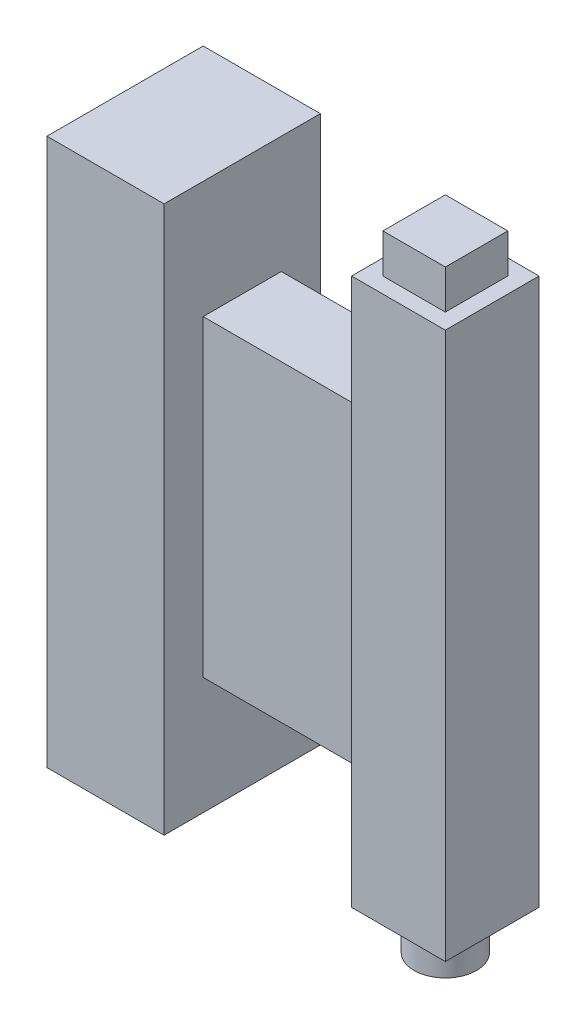
ISO-10303-21;
HEADER;
FILE_DESCRIPTION(('STEP AP214'),'2;1');
FILE_NAME('part.step','',(''),(''),'','','');
FILE_SCHEMA(('AUTOMOTIVE_DESIGN { 1 0 10303 214 1 1 1 1 }'));
ENDSEC;
DATA;
#1=APPLICATION_CONTEXT('core data for automotive mechanical design processes');
#2=APPLICATION_PROTOCOL_DEFINITION('international standard','automotive_design',2000,#1);
#3=PRODUCT_CONTEXT('',#1,'mechanical');
#4=PRODUCT('Part','Part','',(#3));
#5=PRODUCT_RELATED_PRODUCT_CATEGORY('part','',(#4));
#6=PRODUCT_DEFINITION_FORMATION('','',#4);
#7=PRODUCT_DEFINITION_CONTEXT('part definition',#1,'design');
#8=PRODUCT_DEFINITION('design','',#6,#7);
#9=PRODUCT_DEFINITION_SHAPE('','',#8);
#10=(LENGTH_UNIT() NAMED_UNIT(*) SI_UNIT(.MILLI.,.METRE.));
#11=(NAMED_UNIT(*) PLANE_ANGLE_UNIT() SI_UNIT($,.RADIAN.));
#12=(NAMED_UNIT(*) SI_UNIT($,.STERADIAN.) SOLID_ANGLE_UNIT());
#13=UNCERTAINTY_MEASURE_WITH_UNIT(LENGTH_MEASURE(1.E-05),#10,'distance_accuracy_value','');
#14=(GEOMETRIC_REPRESENTATION_CONTEXT(3) GLOBAL_UNCERTAINTY_ASSIGNED_CONTEXT((#13)) GLOBAL_UNIT_ASSIGNED_CONTEXT((#10,
#11,#12)) REPRESENTATION_CONTEXT('',''));
#15=CARTESIAN_POINT('',(0.,0.,0.));
#16=DIRECTION('',(0.,0.,1.));
#17=DIRECTION('',(1.,0.,0.));
#18=AXIS2_PLACEMENT_3D('',#15,#16,#17);
#19=CARTESIAN_POINT('',(39.5,35.,6.));
#20=DIRECTION('',(0.,-1.,0.));
#21=DIRECTION('',(1.,0.,0.));
#22=AXIS2_PLACEMENT_3D('',#19,#20,#21);
#23=PLANE('',#22);
#24=DIRECTION('',(-1.,0.,0.));
#25=VECTOR('',#24,1.);
#26=CARTESIAN_POINT('',(39.5,35.,-6.));
#27=LINE('',#26,#25);
#28=CARTESIAN_POINT('',(39.5,35.,-6.));
#29=VERTEX_POINT('',#28);
#30=CARTESIAN_POINT('',(27.5,35.,-6.));
#31=VERTEX_POINT('',#30);
#32=EDGE_CURVE('E186',#29,#31,#27,.T.);
#33=ORIENTED_EDGE('',*,*,#32,.T.);
#34=DIRECTION('',(0.,0.,-1.));
#35=VECTOR('',#34,1.);
#36=CARTESIAN_POINT('',(27.5,35.,6.));
#37=LINE('',#36,#35);
#38=CARTESIAN_POINT('',(27.5,35.,6.));
#39=VERTEX_POINT('',#38);
#40=EDGE_CURVE('E191',#39,#31,#37,.T.);
#41=ORIENTED_EDGE('',*,*,#40,.F.);
#42=DIRECTION('',(-1.,0.,0.));
#43=VECTOR('',#42,1.);
#44=CARTESIAN_POINT('',(39.5,35.,6.));
#45=LINE('',#44,#43);
#46=CARTESIAN_POINT('',(39.5,35.,6.));
#47=VERTEX_POINT('',#46);
#48=EDGE_CURVE('E190',#47,#39,#45,.T.);
#49=ORIENTED_EDGE('',*,*,#48,.F.);
#50=DIRECTION('',(0.,0.,-1.));
#51=VECTOR('',#50,1.);
#52=CARTESIAN_POINT('',(39.5,35.,6.));
#53=LINE('',#52,#51);
#54=EDGE_CURVE('E199',#47,#29,#53,.T.);
#55=ORIENTED_EDGE('',*,*,#54,.T.);
#56=EDGE_LOOP('',(#33,#41,#49,#55));
#57=FACE_BOUND('',#56,.T.);
#58=DIRECTION('',(0.,0.,1.));
#59=VECTOR('',#58,1.);
#60=CARTESIAN_POINT('',(29.5,35.,4.));
#61=LINE('',#60,#59);
#62=CARTESIAN_POINT('',(29.5,35.,-4.));
#63=VERTEX_POINT('',#62);
#64=CARTESIAN_POINT('',(29.5,35.,4.));
#65=VERTEX_POINT('',#64);
#66=EDGE_CURVE('E55',#63,#65,#61,.T.);
#67=ORIENTED_EDGE('',*,*,#66,.F.);
#68=DIRECTION('',(-1.,0.,0.));
#69=VECTOR('',#68,1.);
#70=CARTESIAN_POINT('',(37.5,35.,-4.));
#71=LINE('',#70,#69);
#72=CARTESIAN_POINT('',(37.5,35.,-4.));
#73=VERTEX_POINT('',#72);
#74=EDGE_CURVE('E59',#73,#63,#71,.T.);
#75=ORIENTED_EDGE('',*,*,#74,.F.);
#76=DIRECTION('',(0.,0.,-1.));
#77=VECTOR('',#76,1.);
#78=CARTESIAN_POINT('',(37.5,35.,4.));
#79=LINE('',#78,#77);
#80=CARTESIAN_POINT('',(37.5,35.,4.));
#81=VERTEX_POINT('',#80);
#82=EDGE_CURVE('E615',#81,#73,#79,.T.);
#83=ORIENTED_EDGE('',*,*,#82,.F.);
#84=DIRECTION('',(1.,0.,0.));
#85=VECTOR('',#84,1.);
#86=CARTESIAN_POINT('',(37.5,35.,4.));
#87=LINE('',#86,#85);
#88=EDGE_CURVE('E613',#65,#81,#87,.T.);
#89=ORIENTED_EDGE('',*,*,#88,.F.);
#90=EDGE_LOOP('',(#67,#75,#83,#89));
#91=FACE_BOUND('',#90,.T.);
#92=ADVANCED_FACE('F39',(#57,#91),#23,.F.);
#93=CARTESIAN_POINT('',(-7.50000000000001,35.,10.));
#94=DIRECTION('',(1.,0.,0.));
#95=DIRECTION('',(0.,1.,0.));
#96=AXIS2_PLACEMENT_3D('',#93,#94,#95);
#97=PLANE('',#96);
#98=CARTESIAN_POINT('',(-7.5,27.,0.));
#99=DIRECTION('',(-1.,0.,0.));
#100=DIRECTION('',(0.,-1.,0.));
#101=AXIS2_PLACEMENT_3D('',#98,#99,#100);
#102=CIRCLE('',#101,5.);
#103=CARTESIAN_POINT('',(-7.5,22.,0.));
#104=VERTEX_POINT('',#103);
#105=EDGE_CURVE('E584',#104,#104,#102,.T.);
#106=ORIENTED_EDGE('',*,*,#105,.F.);
#107=EDGE_LOOP('',(#106));
#108=FACE_BOUND('',#107,.T.);
#109=CARTESIAN_POINT('',(-7.5,9.,0.));
#110=DIRECTION('',(-1.,0.,0.));
#111=DIRECTION('',(0.,-1.,0.));
#112=AXIS2_PLACEMENT_3D('',#109,#110,#111);
#113=CIRCLE('',#112,5.);
#114=CARTESIAN_POINT('',(-7.5,4.,0.));
#115=VERTEX_POINT('',#114);
#116=EDGE_CURVE('E589',#115,#115,#113,.T.);
#117=ORIENTED_EDGE('',*,*,#116,.F.);
#118=EDGE_LOOP('',(#117));
#119=FACE_BOUND('',#118,.T.);
#120=CARTESIAN_POINT('',(-7.5,-9.,0.));
#121=DIRECTION('',(-1.,0.,0.));
#122=DIRECTION('',(0.,-1.,0.));
#123=AXIS2_PLACEMENT_3D('',#120,#121,#122);
#124=CIRCLE('',#123,5.);
#125=CARTESIAN_POINT('',(-7.5,-14.,0.));
#126=VERTEX_POINT('',#125);
#127=EDGE_CURVE('E597',#126,#126,#124,.T.);
#128=ORIENTED_EDGE('',*,*,#127,.F.);
#129=EDGE_LOOP('',(#128));
#130=FACE_BOUND('',#129,.T.);
#131=CARTESIAN_POINT('',(-7.5,-27.,0.));
#132=DIRECTION('',(-1.,0.,0.));
#133=DIRECTION('',(0.,-1.,0.));
#134=AXIS2_PLACEMENT_3D('',#131,#132,#133);
#135=CIRCLE('',#134,5.);
#136=CARTESIAN_POINT('',(-7.5,-32.,0.));
#137=VERTEX_POINT('',#136);
#138=EDGE_CURVE('E603',#137,#137,#135,.T.);
#139=ORIENTED_EDGE('',*,*,#138,.F.);
#140=EDGE_LOOP('',(#139));
#141=FACE_BOUND('',#140,.T.);
#142=DIRECTION('',(0.,-1.,0.));
#143=VECTOR('',#142,1.);
#144=CARTESIAN_POINT('',(-7.50000000000001,35.,-10.));
#145=LINE('',#144,#143);
#146=CARTESIAN_POINT('',(-7.50000000000001,35.,-10.));
#147=VERTEX_POINT('',#146);
#148=CARTESIAN_POINT('',(-7.5,-35.,-10.));
#149=VERTEX_POINT('',#148);
#150=EDGE_CURVE('E240',#147,#149,#145,.T.);
#151=ORIENTED_EDGE('',*,*,#150,.T.);
#152=DIRECTION('',(0.,0.,-1.));
#153=VECTOR('',#152,1.);
#154=CARTESIAN_POINT('',(-7.5,-35.,10.));
#155=LINE('',#154,#153);
#156=CARTESIAN_POINT('',(-7.5,-35.,10.));
#157=VERTEX_POINT('',#156);
#158=EDGE_CURVE('E43',#157,#149,#155,.T.);
#159=ORIENTED_EDGE('',*,*,#158,.F.);
#160=DIRECTION('',(0.,-1.,0.));
#161=VECTOR('',#160,1.);
#162=CARTESIAN_POINT('',(-7.50000000000001,35.,10.));
#163=LINE('',#162,#161);
#164=CARTESIAN_POINT('',(-7.50000000000001,35.,10.));
#165=VERTEX_POINT('',#164);
#166=EDGE_CURVE('E241',#165,#157,#163,.T.);
#167=ORIENTED_EDGE('',*,*,#166,.F.);
#168=DIRECTION('',(0.,0.,-1.));
#169=VECTOR('',#168,1.);
#170=CARTESIAN_POINT('',(-7.50000000000001,35.,10.));
#171=LINE('',#170,#169);
#172=EDGE_CURVE('E251',#165,#147,#171,.T.);
#173=ORIENTED_EDGE('',*,*,#172,.T.);
#174=EDGE_LOOP('',(#151,#159,#167,#173));
#175=FACE_BOUND('',#174,.T.);
#176=ADVANCED_FACE('F41',(#108,#119,#130,#141,#175),#97,.F.);
#177=CARTESIAN_POINT('',(7.5,-35.,10.));
#178=DIRECTION('',(0.,1.,0.));
#179=DIRECTION('',(0.,0.,1.));
#180=AXIS2_PLACEMENT_3D('',#177,#178,#179);
#181=PLANE('',#180);
#182=DIRECTION('',(1.,0.,0.));
#183=VECTOR('',#182,1.);
#184=CARTESIAN_POINT('',(7.5,-35.,-10.));
#185=LINE('',#184,#183);
#186=CARTESIAN_POINT('',(7.5,-35.,-10.));
#187=VERTEX_POINT('',#186);
#188=EDGE_CURVE('E254',#149,#187,#185,.T.);
#189=ORIENTED_EDGE('',*,*,#188,.T.);
#190=DIRECTION('',(0.,0.,-1.));
#191=VECTOR('',#190,1.);
#192=CARTESIAN_POINT('',(7.5,-35.,10.));
#193=LINE('',#192,#191);
#194=CARTESIAN_POINT('',(7.5,-35.,10.));
#195=VERTEX_POINT('',#194);
#196=EDGE_CURVE('E263',#195,#187,#193,.T.);
#197=ORIENTED_EDGE('',*,*,#196,.F.);
#198=DIRECTION('',(1.,0.,0.));
#199=VECTOR('',#198,1.);
#200=CARTESIAN_POINT('',(7.5,-35.,10.));
#201=LINE('',#200,#199);
#202=EDGE_CURVE('E244',#157,#195,#201,.T.);
#203=ORIENTED_EDGE('',*,*,#202,.F.);
#204=ORIENTED_EDGE('',*,*,#158,.T.);
#205=EDGE_LOOP('',(#189,#197,#203,#204));
#206=FACE_BOUND('',#205,.T.);
#207=ADVANCED_FACE('F272',(#206),#181,.F.);
#208=CARTESIAN_POINT('',(7.49999999999999,35.,10.));
#209=DIRECTION('',(-1.,0.,0.));
#210=DIRECTION('',(0.,-1.,0.));
#211=AXIS2_PLACEMENT_3D('',#208,#209,#210);
#212=PLANE('',#211);
#213=DIRECTION('',(0.,0.,-1.));
#214=VECTOR('',#213,1.);
#215=CARTESIAN_POINT('',(7.5,20.,5.));
#216=LINE('',#215,#214);
#217=CARTESIAN_POINT('',(7.5,20.,5.));
#218=VERTEX_POINT('',#217);
#219=CARTESIAN_POINT('',(7.5,20.,-5.));
#220=VERTEX_POINT('',#219);
#221=EDGE_CURVE('E219',#218,#220,#216,.T.);
#222=ORIENTED_EDGE('',*,*,#221,.T.);
#223=DIRECTION('',(0.,-1.,0.));
#224=VECTOR('',#223,1.);
#225=CARTESIAN_POINT('',(7.5,-20.,-5.));
#226=LINE('',#225,#224);
#227=CARTESIAN_POINT('',(7.5,-20.,-5.));
#228=VERTEX_POINT('',#227);
#229=EDGE_CURVE('E208',#220,#228,#226,.T.);
#230=ORIENTED_EDGE('',*,*,#229,.T.);
#231=DIRECTION('',(0.,0.,-1.));
#232=VECTOR('',#231,1.);
#233=CARTESIAN_POINT('',(7.5,-20.,5.));
#234=LINE('',#233,#232);
#235=CARTESIAN_POINT('',(7.5,-20.,5.));
#236=VERTEX_POINT('',#235);
#237=EDGE_CURVE('E237',#236,#228,#234,.T.);
#238=ORIENTED_EDGE('',*,*,#237,.F.);
#239=DIRECTION('',(0.,-1.,0.));
#240=VECTOR('',#239,1.);
#241=CARTESIAN_POINT('',(7.5,-20.,5.));
#242=LINE('',#241,#240);
#243=EDGE_CURVE('E209',#218,#236,#242,.T.);
#244=ORIENTED_EDGE('',*,*,#243,.F.);
#245=EDGE_LOOP('',(#222,#230,#238,#244));
#246=FACE_BOUND('',#245,.T.);
#247=DIRECTION('',(0.,1.,0.));
#248=VECTOR('',#247,1.);
#249=CARTESIAN_POINT('',(7.49999999999999,35.,-10.));
#250=LINE('',#249,#248);
#251=CARTESIAN_POINT('',(7.49999999999999,35.,-10.));
#252=VERTEX_POINT('',#251);
#253=EDGE_CURVE('E256',#187,#252,#250,.T.);
#254=ORIENTED_EDGE('',*,*,#253,.T.);
#255=DIRECTION('',(0.,0.,-1.));
#256=VECTOR('',#255,1.);
#257=CARTESIAN_POINT('',(7.49999999999999,35.,10.));
#258=LINE('',#257,#256);
#259=CARTESIAN_POINT('',(7.49999999999999,35.,10.));
#260=VERTEX_POINT('',#259);
#261=EDGE_CURVE('E261',#260,#252,#258,.T.);
#262=ORIENTED_EDGE('',*,*,#261,.F.);
#263=DIRECTION('',(0.,1.,0.));
#264=VECTOR('',#263,1.);
#265=CARTESIAN_POINT('',(7.49999999999999,35.,10.));
#266=LINE('',#265,#264);
#267=EDGE_CURVE('E247',#195,#260,#266,.T.);
#268=ORIENTED_EDGE('',*,*,#267,.F.);
#269=ORIENTED_EDGE('',*,*,#196,.T.);
#270=EDGE_LOOP('',(#254,#262,#268,#269));
#271=FACE_BOUND('',#270,.T.);
#272=ADVANCED_FACE('F281',(#246,#271),#212,.F.);
#273=CARTESIAN_POINT('',(7.49999999999999,35.,10.));
#274=DIRECTION('',(0.,-1.,0.));
#275=DIRECTION('',(1.,0.,0.));
#276=AXIS2_PLACEMENT_3D('',#273,#274,#275);
#277=PLANE('',#276);
#278=DIRECTION('',(-1.,0.,0.));
#279=VECTOR('',#278,1.);
#280=CARTESIAN_POINT('',(7.49999999999999,35.,-10.));
#281=LINE('',#280,#279);
#282=EDGE_CURVE('E245',#252,#147,#281,.T.);
#283=ORIENTED_EDGE('',*,*,#282,.T.);
#284=ORIENTED_EDGE('',*,*,#172,.F.);
#285=DIRECTION('',(-1.,0.,0.));
#286=VECTOR('',#285,1.);
#287=CARTESIAN_POINT('',(7.49999999999999,35.,10.));
#288=LINE('',#287,#286);
#289=EDGE_CURVE('E249',#260,#165,#288,.T.);
#290=ORIENTED_EDGE('',*,*,#289,.F.);
#291=ORIENTED_EDGE('',*,*,#261,.T.);
#292=EDGE_LOOP('',(#283,#284,#290,#291));
#293=FACE_BOUND('',#292,.T.);
#294=ADVANCED_FACE('F284',(#293),#277,.F.);
#295=CARTESIAN_POINT('',(0.,0.,10.));
#296=DIRECTION('',(0.,0.,-1.));
#297=DIRECTION('',(-1.,0.,0.));
#298=AXIS2_PLACEMENT_3D('',#295,#296,#297);
#299=PLANE('',#298);
#300=ORIENTED_EDGE('',*,*,#166,.T.);
#301=ORIENTED_EDGE('',*,*,#202,.T.);
#302=ORIENTED_EDGE('',*,*,#267,.T.);
#303=ORIENTED_EDGE('',*,*,#289,.T.);
#304=EDGE_LOOP('',(#300,#301,#302,#303));
#305=FACE_BOUND('',#304,.T.);
#306=ADVANCED_FACE('F286',(#305),#299,.F.);
#307=CARTESIAN_POINT('',(0.,0.,-10.));
#308=DIRECTION('',(0.,0.,-1.));
#309=DIRECTION('',(-1.,0.,0.));
#310=AXIS2_PLACEMENT_3D('',#307,#308,#309);
#311=PLANE('',#310);
#312=ORIENTED_EDGE('',*,*,#150,.F.);
#313=ORIENTED_EDGE('',*,*,#282,.F.);
#314=ORIENTED_EDGE('',*,*,#253,.F.);
#315=ORIENTED_EDGE('',*,*,#188,.F.);
#316=EDGE_LOOP('',(#312,#313,#314,#315));
#317=FACE_BOUND('',#316,.T.);
#318=ADVANCED_FACE('F279',(#317),#311,.T.);
#319=CARTESIAN_POINT('',(7.5,-20.,5.));
#320=DIRECTION('',(0.,1.,0.));
#321=DIRECTION('',(0.,0.,1.));
#322=AXIS2_PLACEMENT_3D('',#319,#320,#321);
#323=PLANE('',#322);
#324=DIRECTION('',(1.,0.,0.));
#325=VECTOR('',#324,1.);
#326=CARTESIAN_POINT('',(7.5,-20.,-5.));
#327=LINE('',#326,#325);
#328=CARTESIAN_POINT('',(27.5,-20.,-5.));
#329=VERTEX_POINT('',#328);
#330=EDGE_CURVE('E222',#228,#329,#327,.T.);
#331=ORIENTED_EDGE('',*,*,#330,.T.);
#332=DIRECTION('',(0.,0.,-1.));
#333=VECTOR('',#332,1.);
#334=CARTESIAN_POINT('',(27.5,-20.,5.));
#335=LINE('',#334,#333);
#336=CARTESIAN_POINT('',(27.5,-20.,5.));
#337=VERTEX_POINT('',#336);
#338=EDGE_CURVE('E234',#337,#329,#335,.T.);
#339=ORIENTED_EDGE('',*,*,#338,.F.);
#340=DIRECTION('',(1.,0.,0.));
#341=VECTOR('',#340,1.);
#342=CARTESIAN_POINT('',(7.5,-20.,5.));
#343=LINE('',#342,#341);
#344=EDGE_CURVE('E212',#236,#337,#343,.T.);
#345=ORIENTED_EDGE('',*,*,#344,.F.);
#346=ORIENTED_EDGE('',*,*,#237,.T.);
#347=EDGE_LOOP('',(#331,#339,#345,#346));
#348=FACE_BOUND('',#347,.T.);
#349=ADVANCED_FACE('F293',(#348),#323,.F.);
#350=CARTESIAN_POINT('',(7.5,20.,5.));
#351=DIRECTION('',(0.,-1.,0.));
#352=DIRECTION('',(0.,0.,-1.));
#353=AXIS2_PLACEMENT_3D('',#350,#351,#352);
#354=PLANE('',#353);
#355=DIRECTION('',(-1.,0.,0.));
#356=VECTOR('',#355,1.);
#357=CARTESIAN_POINT('',(7.5,20.,-5.));
#358=LINE('',#357,#356);
#359=CARTESIAN_POINT('',(27.5,20.,-5.));
#360=VERTEX_POINT('',#359);
#361=EDGE_CURVE('E213',#360,#220,#358,.T.);
#362=ORIENTED_EDGE('',*,*,#361,.T.);
#363=ORIENTED_EDGE('',*,*,#221,.F.);
#364=DIRECTION('',(-1.,0.,0.));
#365=VECTOR('',#364,1.);
#366=CARTESIAN_POINT('',(7.5,20.,5.));
#367=LINE('',#366,#365);
#368=CARTESIAN_POINT('',(27.5,20.,5.));
#369=VERTEX_POINT('',#368);
#370=EDGE_CURVE('E217',#369,#218,#367,.T.);
#371=ORIENTED_EDGE('',*,*,#370,.F.);
#372=DIRECTION('',(0.,0.,-1.));
#373=VECTOR('',#372,1.);
#374=CARTESIAN_POINT('',(27.5,20.,5.));
#375=LINE('',#374,#373);
#376=EDGE_CURVE('E232',#369,#360,#375,.T.);
#377=ORIENTED_EDGE('',*,*,#376,.T.);
#378=EDGE_LOOP('',(#362,#363,#371,#377));
#379=FACE_BOUND('',#378,.T.);
#380=ADVANCED_FACE('F327',(#379),#354,.F.);
#381=CARTESIAN_POINT('',(0.,0.,5.));
#382=DIRECTION('',(0.,0.,-1.));
#383=DIRECTION('',(-1.,0.,0.));
#384=AXIS2_PLACEMENT_3D('',#381,#382,#383);
#385=PLANE('',#384);
#386=ORIENTED_EDGE('',*,*,#243,.T.);
#387=ORIENTED_EDGE('',*,*,#344,.T.);
#388=DIRECTION('',(0.,1.,0.));
#389=VECTOR('',#388,1.);
#390=CARTESIAN_POINT('',(27.5,20.,5.));
#391=LINE('',#390,#389);
#392=EDGE_CURVE('E215',#337,#369,#391,.T.);
#393=ORIENTED_EDGE('',*,*,#392,.T.);
#394=ORIENTED_EDGE('',*,*,#370,.T.);
#395=EDGE_LOOP('',(#386,#387,#393,#394));
#396=FACE_BOUND('',#395,.T.);
#397=ADVANCED_FACE('F324',(#396),#385,.F.);
#398=CARTESIAN_POINT('',(0.,0.,-5.));
#399=DIRECTION('',(0.,0.,-1.));
#400=DIRECTION('',(-1.,0.,0.));
#401=AXIS2_PLACEMENT_3D('',#398,#399,#400);
#402=PLANE('',#401);
#403=ORIENTED_EDGE('',*,*,#229,.F.);
#404=ORIENTED_EDGE('',*,*,#361,.F.);
#405=DIRECTION('',(0.,1.,0.));
#406=VECTOR('',#405,1.);
#407=CARTESIAN_POINT('',(27.5,20.,-5.));
#408=LINE('',#407,#406);
#409=EDGE_CURVE('E225',#329,#360,#408,.T.);
#410=ORIENTED_EDGE('',*,*,#409,.F.);
#411=ORIENTED_EDGE('',*,*,#330,.F.);
#412=EDGE_LOOP('',(#403,#404,#410,#411));
#413=FACE_BOUND('',#412,.T.);
#414=ADVANCED_FACE('F322',(#413),#402,.T.);
#415=CARTESIAN_POINT('',(27.5,-35.,6.));
#416=DIRECTION('',(1.,0.,0.));
#417=DIRECTION('',(0.,0.,-1.));
#418=AXIS2_PLACEMENT_3D('',#415,#416,#417);
#419=PLANE('',#418);
#420=DIRECTION('',(0.,-1.,0.));
#421=VECTOR('',#420,1.);
#422=CARTESIAN_POINT('',(27.5,-35.,-6.));
#423=LINE('',#422,#421);
#424=CARTESIAN_POINT('',(27.5,-35.,-6.));
#425=VERTEX_POINT('',#424);
#426=EDGE_CURVE('E173',#31,#425,#423,.T.);
#427=ORIENTED_EDGE('',*,*,#426,.T.);
#428=DIRECTION('',(0.,0.,-1.));
#429=VECTOR('',#428,1.);
#430=CARTESIAN_POINT('',(27.5,-35.,6.));
#431=LINE('',#430,#429);
#432=CARTESIAN_POINT('',(27.5,-35.,6.));
#433=VERTEX_POINT('',#432);
#434=EDGE_CURVE('E205',#433,#425,#431,.T.);
#435=ORIENTED_EDGE('',*,*,#434,.F.);
#436=DIRECTION('',(0.,-1.,0.));
#437=VECTOR('',#436,1.);
#438=CARTESIAN_POINT('',(27.5,-35.,6.));
#439=LINE('',#438,#437);
#440=EDGE_CURVE('E182',#39,#433,#439,.T.);
#441=ORIENTED_EDGE('',*,*,#440,.F.);
#442=ORIENTED_EDGE('',*,*,#40,.T.);
#443=EDGE_LOOP('',(#427,#435,#441,#442));
#444=FACE_BOUND('',#443,.T.);
#445=ORIENTED_EDGE('',*,*,#338,.T.);
#446=ORIENTED_EDGE('',*,*,#409,.T.);
#447=ORIENTED_EDGE('',*,*,#376,.F.);
#448=ORIENTED_EDGE('',*,*,#392,.F.);
#449=EDGE_LOOP('',(#445,#446,#447,#448));
#450=FACE_BOUND('',#449,.T.);
#451=ADVANCED_FACE('F318',(#444,#450),#419,.F.);
#452=CARTESIAN_POINT('',(39.5,-35.,6.));
#453=DIRECTION('',(0.,1.,0.));
#454=DIRECTION('',(0.,0.,1.));
#455=AXIS2_PLACEMENT_3D('',#452,#453,#454);
#456=PLANE('',#455);
#457=CARTESIAN_POINT('',(33.5,-35.,0.));
#458=DIRECTION('',(0.,-1.,0.));
#459=DIRECTION('',(0.,0.,-1.));
#460=AXIS2_PLACEMENT_3D('',#457,#458,#459);
#461=CIRCLE('',#460,4.00000000000001);
#462=CARTESIAN_POINT('',(33.5,-35.,-4.00000000000001));
#463=VERTEX_POINT('',#462);
#464=EDGE_CURVE('E11',#463,#463,#461,.T.);
#465=ORIENTED_EDGE('',*,*,#464,.F.);
#466=EDGE_LOOP('',(#465));
#467=FACE_BOUND('',#466,.T.);
#468=DIRECTION('',(1.,0.,0.));
#469=VECTOR('',#468,1.);
#470=CARTESIAN_POINT('',(39.5,-35.,-6.));
#471=LINE('',#470,#469);
#472=CARTESIAN_POINT('',(39.5,-35.,-6.));
#473=VERTEX_POINT('',#472);
#474=EDGE_CURVE('E176',#425,#473,#471,.T.);
#475=ORIENTED_EDGE('',*,*,#474,.T.);
#476=DIRECTION('',(0.,0.,-1.));
#477=VECTOR('',#476,1.);
#478=CARTESIAN_POINT('',(39.5,-35.,6.));
#479=LINE('',#478,#477);
#480=CARTESIAN_POINT('',(39.5,-35.,6.));
#481=VERTEX_POINT('',#480);
#482=EDGE_CURVE('E202',#481,#473,#479,.T.);
#483=ORIENTED_EDGE('',*,*,#482,.F.);
#484=DIRECTION('',(1.,0.,0.));
#485=VECTOR('',#484,1.);
#486=CARTESIAN_POINT('',(39.5,-35.,6.));
#487=LINE('',#486,#485);
#488=EDGE_CURVE('E185',#433,#481,#487,.T.);
#489=ORIENTED_EDGE('',*,*,#488,.F.);
#490=ORIENTED_EDGE('',*,*,#434,.T.);
#491=EDGE_LOOP('',(#475,#483,#489,#490));
#492=FACE_BOUND('',#491,.T.);
#493=ADVANCED_FACE('F314',(#467,#492),#456,.F.);
#494=CARTESIAN_POINT('',(39.5,-35.,6.));
#495=DIRECTION('',(-1.,0.,0.));
#496=DIRECTION('',(0.,0.,1.));
#497=AXIS2_PLACEMENT_3D('',#494,#495,#496);
#498=PLANE('',#497);
#499=DIRECTION('',(0.,1.,0.));
#500=VECTOR('',#499,1.);
#501=CARTESIAN_POINT('',(39.5,-35.,-6.));
#502=LINE('',#501,#500);
#503=EDGE_CURVE('E194',#473,#29,#502,.T.);
#504=ORIENTED_EDGE('',*,*,#503,.T.);
#505=ORIENTED_EDGE('',*,*,#54,.F.);
#506=DIRECTION('',(0.,1.,0.));
#507=VECTOR('',#506,1.);
#508=CARTESIAN_POINT('',(39.5,-35.,6.));
#509=LINE('',#508,#507);
#510=EDGE_CURVE('E188',#481,#47,#509,.T.);
#511=ORIENTED_EDGE('',*,*,#510,.F.);
#512=ORIENTED_EDGE('',*,*,#482,.T.);
#513=EDGE_LOOP('',(#504,#505,#511,#512));
#514=FACE_BOUND('',#513,.T.);
#515=ADVANCED_FACE('F310',(#514),#498,.F.);
#516=CARTESIAN_POINT('',(0.,0.,6.));
#517=DIRECTION('',(0.,0.,1.));
#518=DIRECTION('',(1.,0.,0.));
#519=AXIS2_PLACEMENT_3D('',#516,#517,#518);
#520=PLANE('',#519);
#521=ORIENTED_EDGE('',*,*,#440,.T.);
#522=ORIENTED_EDGE('',*,*,#488,.T.);
#523=ORIENTED_EDGE('',*,*,#510,.T.);
#524=ORIENTED_EDGE('',*,*,#48,.T.);
#525=EDGE_LOOP('',(#521,#522,#523,#524));
#526=FACE_BOUND('',#525,.T.);
#527=ADVANCED_FACE('F313',(#526),#520,.T.);
#528=CARTESIAN_POINT('',(0.,0.,-6.));
#529=DIRECTION('',(0.,0.,1.));
#530=DIRECTION('',(1.,0.,0.));
#531=AXIS2_PLACEMENT_3D('',#528,#529,#530);
#532=PLANE('',#531);
#533=ORIENTED_EDGE('',*,*,#426,.F.);
#534=ORIENTED_EDGE('',*,*,#32,.F.);
#535=ORIENTED_EDGE('',*,*,#503,.F.);
#536=ORIENTED_EDGE('',*,*,#474,.F.);
#537=EDGE_LOOP('',(#533,#534,#535,#536));
#538=FACE_BOUND('',#537,.T.);
#539=ADVANCED_FACE('F308',(#538),#532,.F.);
#540=CARTESIAN_POINT('',(29.5,40.,4.));
#541=DIRECTION('',(1.,0.,0.));
#542=DIRECTION('',(0.,1.,0.));
#543=AXIS2_PLACEMENT_3D('',#540,#541,#542);
#544=PLANE('',#543);
#545=ORIENTED_EDGE('',*,*,#66,.T.);
#546=DIRECTION('',(0.,-1.,0.));
#547=VECTOR('',#546,1.);
#548=CARTESIAN_POINT('',(29.5,40.,4.));
#549=LINE('',#548,#547);
#550=CARTESIAN_POINT('',(29.5,40.,4.));
#551=VERTEX_POINT('',#550);
#552=EDGE_CURVE('E156',#551,#65,#549,.T.);
#553=ORIENTED_EDGE('',*,*,#552,.F.);
#554=DIRECTION('',(0.,0.,1.));
#555=VECTOR('',#554,1.);
#556=CARTESIAN_POINT('',(29.5,40.,4.));
#557=LINE('',#556,#555);
#558=CARTESIAN_POINT('',(29.5,40.,-4.));
#559=VERTEX_POINT('',#558);
#560=EDGE_CURVE('E162',#559,#551,#557,.T.);
#561=ORIENTED_EDGE('',*,*,#560,.F.);
#562=DIRECTION('',(0.,-1.,0.));
#563=VECTOR('',#562,1.);
#564=CARTESIAN_POINT('',(29.5,40.,-4.));
#565=LINE('',#564,#563);
#566=EDGE_CURVE('E611',#559,#63,#565,.T.);
#567=ORIENTED_EDGE('',*,*,#566,.T.);
#568=EDGE_LOOP('',(#545,#553,#561,#567));
#569=FACE_BOUND('',#568,.T.);
#570=ADVANCED_FACE('F172',(#569),#544,.F.);
#571=CARTESIAN_POINT('',(37.5,40.,4.));
#572=DIRECTION('',(0.,0.,-1.));
#573=DIRECTION('',(-1.,0.,0.));
#574=AXIS2_PLACEMENT_3D('',#571,#572,#573);
#575=PLANE('',#574);
#576=ORIENTED_EDGE('',*,*,#88,.T.);
#577=DIRECTION('',(0.,-1.,0.));
#578=VECTOR('',#577,1.);
#579=CARTESIAN_POINT('',(37.5,40.,4.));
#580=LINE('',#579,#578);
#581=CARTESIAN_POINT('',(37.5,40.,4.));
#582=VERTEX_POINT('',#581);
#583=EDGE_CURVE('E158',#582,#81,#580,.T.);
#584=ORIENTED_EDGE('',*,*,#583,.F.);
#585=DIRECTION('',(1.,0.,0.));
#586=VECTOR('',#585,1.);
#587=CARTESIAN_POINT('',(37.5,40.,4.));
#588=LINE('',#587,#586);
#589=EDGE_CURVE('E151',#551,#582,#588,.T.);
#590=ORIENTED_EDGE('',*,*,#589,.F.);
#591=ORIENTED_EDGE('',*,*,#552,.T.);
#592=EDGE_LOOP('',(#576,#584,#590,#591));
#593=FACE_BOUND('',#592,.T.);
#594=ADVANCED_FACE('F154',(#593),#575,.F.);
#595=CARTESIAN_POINT('',(37.5,40.,4.));
#596=DIRECTION('',(-1.,0.,0.));
#597=DIRECTION('',(0.,-1.,0.));
#598=AXIS2_PLACEMENT_3D('',#595,#596,#597);
#599=PLANE('',#598);
#600=ORIENTED_EDGE('',*,*,#82,.T.);
#601=DIRECTION('',(0.,-1.,0.));
#602=VECTOR('',#601,1.);
#603=CARTESIAN_POINT('',(37.5,40.,-4.));
#604=LINE('',#603,#602);
#605=CARTESIAN_POINT('',(37.5,40.,-4.));
#606=VERTEX_POINT('',#605);
#607=EDGE_CURVE('E178',#606,#73,#604,.T.);
#608=ORIENTED_EDGE('',*,*,#607,.F.);
#609=DIRECTION('',(0.,0.,-1.));
#610=VECTOR('',#609,1.);
#611=CARTESIAN_POINT('',(37.5,40.,4.));
#612=LINE('',#611,#610);
#613=EDGE_CURVE('E161',#582,#606,#612,.T.);
#614=ORIENTED_EDGE('',*,*,#613,.F.);
#615=ORIENTED_EDGE('',*,*,#583,.T.);
#616=EDGE_LOOP('',(#600,#608,#614,#615));
#617=FACE_BOUND('',#616,.T.);
#618=ADVANCED_FACE('F452',(#617),#599,.F.);
#619=CARTESIAN_POINT('',(37.5,40.,-4.));
#620=DIRECTION('',(0.,0.,1.));
#621=DIRECTION('',(1.,0.,0.));
#622=AXIS2_PLACEMENT_3D('',#619,#620,#621);
#623=PLANE('',#622);
#624=ORIENTED_EDGE('',*,*,#74,.T.);
#625=ORIENTED_EDGE('',*,*,#566,.F.);
#626=DIRECTION('',(-1.,0.,0.));
#627=VECTOR('',#626,1.);
#628=CARTESIAN_POINT('',(37.5,40.,-4.));
#629=LINE('',#628,#627);
#630=EDGE_CURVE('E167',#606,#559,#629,.T.);
#631=ORIENTED_EDGE('',*,*,#630,.F.);
#632=ORIENTED_EDGE('',*,*,#607,.T.);
#633=EDGE_LOOP('',(#624,#625,#631,#632));
#634=FACE_BOUND('',#633,.T.);
#635=ADVANCED_FACE('F461',(#634),#623,.F.);
#636=CARTESIAN_POINT('',(0.,40.,0.));
#637=DIRECTION('',(0.,1.,0.));
#638=DIRECTION('',(-1.,0.,0.));
#639=AXIS2_PLACEMENT_3D('',#636,#637,#638);
#640=PLANE('',#639);
#641=ORIENTED_EDGE('',*,*,#560,.T.);
#642=ORIENTED_EDGE('',*,*,#589,.T.);
#643=ORIENTED_EDGE('',*,*,#613,.T.);
#644=ORIENTED_EDGE('',*,*,#630,.T.);
#645=EDGE_LOOP('',(#641,#642,#643,#644));
#646=FACE_BOUND('',#645,.T.);
#647=ADVANCED_FACE('F165',(#646),#640,.T.);
#648=CARTESIAN_POINT('',(33.5,-40.,0.));
#649=DIRECTION('',(0.,1.,0.));
#650=DIRECTION('',(0.,0.,1.));
#651=AXIS2_PLACEMENT_3D('',#648,#649,#650);
#652=CYLINDRICAL_SURFACE('',#651,4.00000000000001);
#653=CARTESIAN_POINT('',(33.5,-40.,0.));
#654=DIRECTION('',(0.,-1.,0.));
#655=DIRECTION('',(0.,0.,-1.));
#656=AXIS2_PLACEMENT_3D('',#653,#654,#655);
#657=CIRCLE('',#656,4.00000000000001);
#658=CARTESIAN_POINT('',(33.5,-40.,-4.00000000000001));
#659=VERTEX_POINT('',#658);
#660=EDGE_CURVE('E583',#659,#659,#657,.T.);
#661=ORIENTED_EDGE('',*,*,#660,.F.);
#662=EDGE_LOOP('',(#661));
#663=FACE_BOUND('',#662,.T.);
#664=ORIENTED_EDGE('',*,*,#464,.T.);
#665=EDGE_LOOP('',(#664));
#666=FACE_BOUND('',#665,.T.);
#667=ADVANCED_FACE('F479',(#663,#666),#652,.T.);
#668=CARTESIAN_POINT('',(33.5,-40.,0.));
#669=DIRECTION('',(0.,-1.,0.));
#670=DIRECTION('',(0.,0.,-1.));
#671=AXIS2_PLACEMENT_3D('',#668,#669,#670);
#672=PLANE('',#671);
#673=ORIENTED_EDGE('',*,*,#660,.T.);
#674=EDGE_LOOP('',(#673));
#675=FACE_BOUND('',#674,.T.);
#676=ADVANCED_FACE('F487',(#675),#672,.T.);
#677=CARTESIAN_POINT('',(-2.5,-27.,0.));
#678=DIRECTION('',(-1.,0.,0.));
#679=DIRECTION('',(0.,-1.,0.));
#680=AXIS2_PLACEMENT_3D('',#677,#678,#679);
#681=CYLINDRICAL_SURFACE('',#680,5.);
#682=CARTESIAN_POINT('',(-2.5,-27.,0.));
#683=DIRECTION('',(-1.,0.,0.));
#684=DIRECTION('',(0.,-1.,0.));
#685=AXIS2_PLACEMENT_3D('',#682,#683,#684);
#686=CIRCLE('',#685,5.);
#687=CARTESIAN_POINT('',(-2.5,-32.,0.));
#688=VERTEX_POINT('',#687);
#689=EDGE_CURVE('E606',#688,#688,#686,.T.);
#690=ORIENTED_EDGE('',*,*,#689,.F.);
#691=EDGE_LOOP('',(#690));
#692=FACE_BOUND('',#691,.T.);
#693=ORIENTED_EDGE('',*,*,#138,.T.);
#694=EDGE_LOOP('',(#693));
#695=FACE_BOUND('',#694,.T.);
#696=ADVANCED_FACE('F497',(#692,#695),#681,.F.);
#697=CARTESIAN_POINT('',(-2.5,-27.,0.));
#698=DIRECTION('',(-1.,0.,0.));
#699=DIRECTION('',(0.,-1.,0.));
#700=AXIS2_PLACEMENT_3D('',#697,#698,#699);
#701=PLANE('',#700);
#702=ORIENTED_EDGE('',*,*,#689,.T.);
#703=EDGE_LOOP('',(#702));
#704=FACE_BOUND('',#703,.T.);
#705=ADVANCED_FACE('F507',(#704),#701,.T.);
#706=CARTESIAN_POINT('',(-2.5,-9.,0.));
#707=DIRECTION('',(-1.,0.,0.));
#708=DIRECTION('',(0.,-1.,0.));
#709=AXIS2_PLACEMENT_3D('',#706,#707,#708);
#710=CYLINDRICAL_SURFACE('',#709,5.);
#711=CARTESIAN_POINT('',(-2.5,-9.,0.));
#712=DIRECTION('',(-1.,0.,0.));
#713=DIRECTION('',(0.,-1.,0.));
#714=AXIS2_PLACEMENT_3D('',#711,#712,#713);
#715=CIRCLE('',#714,5.);
#716=CARTESIAN_POINT('',(-2.5,-14.,0.));
#717=VERTEX_POINT('',#716);
#718=EDGE_CURVE('E600',#717,#717,#715,.T.);
#719=ORIENTED_EDGE('',*,*,#718,.F.);
#720=EDGE_LOOP('',(#719));
#721=FACE_BOUND('',#720,.T.);
#722=ORIENTED_EDGE('',*,*,#127,.T.);
#723=EDGE_LOOP('',(#722));
#724=FACE_BOUND('',#723,.T.);
#725=ADVANCED_FACE('F517',(#721,#724),#710,.F.);
#726=CARTESIAN_POINT('',(-2.5,-9.,0.));
#727=DIRECTION('',(-1.,0.,0.));
#728=DIRECTION('',(0.,-1.,0.));
#729=AXIS2_PLACEMENT_3D('',#726,#727,#728);
#730=PLANE('',#729);
#731=ORIENTED_EDGE('',*,*,#718,.T.);
#732=EDGE_LOOP('',(#731));
#733=FACE_BOUND('',#732,.T.);
#734=ADVANCED_FACE('F527',(#733),#730,.T.);
#735=CARTESIAN_POINT('',(-2.5,9.,0.));
#736=DIRECTION('',(-1.,0.,0.));
#737=DIRECTION('',(0.,-1.,0.));
#738=AXIS2_PLACEMENT_3D('',#735,#736,#737);
#739=CYLINDRICAL_SURFACE('',#738,5.);
#740=CARTESIAN_POINT('',(-2.5,9.,0.));
#741=DIRECTION('',(-1.,0.,0.));
#742=DIRECTION('',(0.,-1.,0.));
#743=AXIS2_PLACEMENT_3D('',#740,#741,#742);
#744=CIRCLE('',#743,5.);
#745=CARTESIAN_POINT('',(-2.5,4.,0.));
#746=VERTEX_POINT('',#745);
#747=EDGE_CURVE('E594',#746,#746,#744,.T.);
#748=ORIENTED_EDGE('',*,*,#747,.F.);
#749=EDGE_LOOP('',(#748));
#750=FACE_BOUND('',#749,.T.);
#751=ORIENTED_EDGE('',*,*,#116,.T.);
#752=EDGE_LOOP('',(#751));
#753=FACE_BOUND('',#752,.T.);
#754=ADVANCED_FACE('F537',(#750,#753),#739,.F.);
#755=CARTESIAN_POINT('',(-2.5,9.,0.));
#756=DIRECTION('',(-1.,0.,0.));
#757=DIRECTION('',(0.,-1.,0.));
#758=AXIS2_PLACEMENT_3D('',#755,#756,#757);
#759=PLANE('',#758);
#760=ORIENTED_EDGE('',*,*,#747,.T.);
#761=EDGE_LOOP('',(#760));
#762=FACE_BOUND('',#761,.T.);
#763=ADVANCED_FACE('F547',(#762),#759,.T.);
#764=CARTESIAN_POINT('',(-2.5,27.,0.));
#765=DIRECTION('',(-1.,0.,0.));
#766=DIRECTION('',(0.,-1.,0.));
#767=AXIS2_PLACEMENT_3D('',#764,#765,#766);
#768=CYLINDRICAL_SURFACE('',#767,5.);
#769=CARTESIAN_POINT('',(-2.5,27.,0.));
#770=DIRECTION('',(-1.,0.,0.));
#771=DIRECTION('',(0.,-1.,0.));
#772=AXIS2_PLACEMENT_3D('',#769,#770,#771);
#773=CIRCLE('',#772,5.);
#774=CARTESIAN_POINT('',(-2.5,22.,0.));
#775=VERTEX_POINT('',#774);
#776=EDGE_CURVE('E582',#775,#775,#773,.T.);
#777=ORIENTED_EDGE('',*,*,#776,.F.);
#778=EDGE_LOOP('',(#777));
#779=FACE_BOUND('',#778,.T.);
#780=ORIENTED_EDGE('',*,*,#105,.T.);
#781=EDGE_LOOP('',(#780));
#782=FACE_BOUND('',#781,.T.);
#783=ADVANCED_FACE('F557',(#779,#782),#768,.F.);
#784=CARTESIAN_POINT('',(-2.5,27.,0.));
#785=DIRECTION('',(-1.,0.,0.));
#786=DIRECTION('',(0.,-1.,0.));
#787=AXIS2_PLACEMENT_3D('',#784,#785,#786);
#788=PLANE('',#787);
#789=ORIENTED_EDGE('',*,*,#776,.T.);
#790=EDGE_LOOP('',(#789));
#791=FACE_BOUND('',#790,.T.);
#792=ADVANCED_FACE('F567',(#791),#788,.T.);
#793=CLOSED_SHELL('',(#92,#176,#207,#272,#294,#306,#318,#349,#380,#397,#414,#451,#493,#515,#527,
#539,#570,#594,#618,#635,#647,#667,#676,#696,#705,#725,#734,#754,#763,#783,#792));
#794=MANIFOLD_SOLID_BREP('B2',#793);
#795=ADVANCED_BREP_SHAPE_REPRESENTATION('',(#18,#794),#14);
#796=SHAPE_DEFINITION_REPRESENTATION(#9,#795);
ENDSEC;
END-ISO-10303-21;
